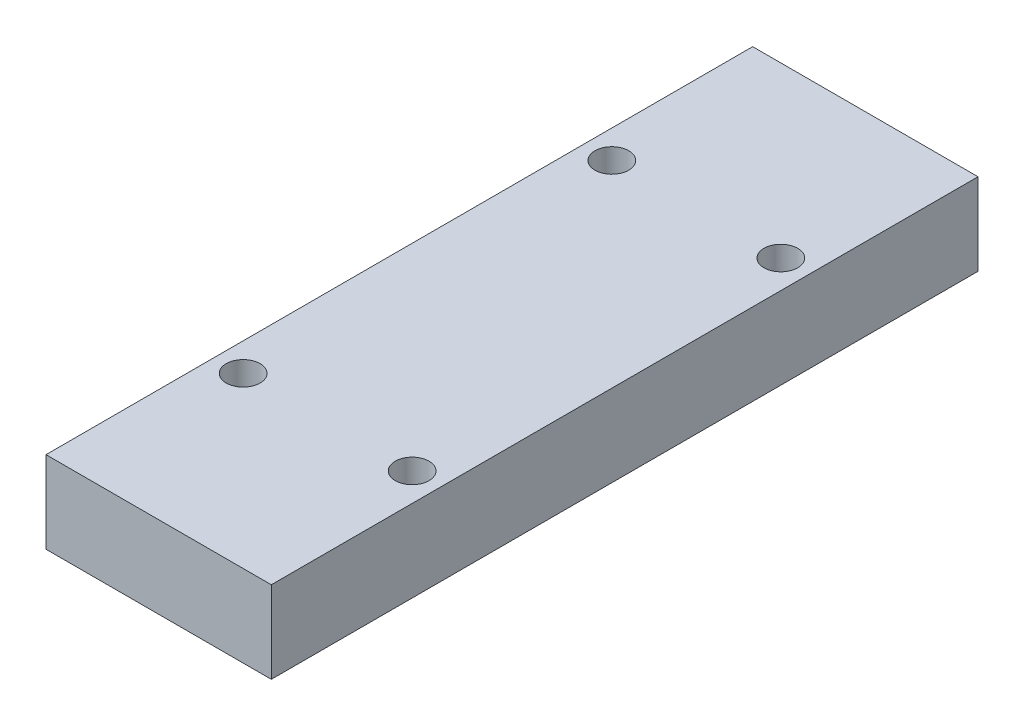
ISO-10303-21;
HEADER;
FILE_DESCRIPTION(('STEP AP214'),'2;1');
FILE_NAME('part.step','',(''),(''),'','','');
FILE_SCHEMA(('AUTOMOTIVE_DESIGN { 1 0 10303 214 1 1 1 1 }'));
ENDSEC;
DATA;
#1=APPLICATION_CONTEXT('core data for automotive mechanical design processes');
#2=APPLICATION_PROTOCOL_DEFINITION('international standard','automotive_design',2000,#1);
#3=PRODUCT_CONTEXT('',#1,'mechanical');
#4=PRODUCT('Part','Part','',(#3));
#5=PRODUCT_RELATED_PRODUCT_CATEGORY('part','',(#4));
#6=PRODUCT_DEFINITION_FORMATION('','',#4);
#7=PRODUCT_DEFINITION_CONTEXT('part definition',#1,'design');
#8=PRODUCT_DEFINITION('design','',#6,#7);
#9=PRODUCT_DEFINITION_SHAPE('','',#8);
#10=(LENGTH_UNIT() NAMED_UNIT(*) SI_UNIT(.MILLI.,.METRE.));
#11=(NAMED_UNIT(*) PLANE_ANGLE_UNIT() SI_UNIT($,.RADIAN.));
#12=(NAMED_UNIT(*) SI_UNIT($,.STERADIAN.) SOLID_ANGLE_UNIT());
#13=UNCERTAINTY_MEASURE_WITH_UNIT(LENGTH_MEASURE(1.E-05),#10,'distance_accuracy_value','');
#14=(GEOMETRIC_REPRESENTATION_CONTEXT(3) GLOBAL_UNCERTAINTY_ASSIGNED_CONTEXT((#13)) GLOBAL_UNIT_ASSIGNED_CONTEXT((#10,
#11,#12)) REPRESENTATION_CONTEXT('',''));
#15=CARTESIAN_POINT('',(0.,0.,0.));
#16=DIRECTION('',(0.,0.,1.));
#17=DIRECTION('',(1.,0.,0.));
#18=AXIS2_PLACEMENT_3D('',#15,#16,#17);
#19=CARTESIAN_POINT('',(11.,4.,69.));
#20=DIRECTION('',(-1.,0.,0.));
#21=DIRECTION('',(0.,-1.,0.));
#22=AXIS2_PLACEMENT_3D('',#19,#20,#21);
#23=PLANE('',#22);
#24=DIRECTION('',(0.,1.,0.));
#25=VECTOR('',#24,1.);
#26=CARTESIAN_POINT('',(11.,4.,0.));
#27=LINE('',#26,#25);
#28=CARTESIAN_POINT('',(11.,-4.,0.));
#29=VERTEX_POINT('',#28);
#30=CARTESIAN_POINT('',(11.,4.,0.));
#31=VERTEX_POINT('',#30);
#32=EDGE_CURVE('E143',#29,#31,#27,.T.);
#33=ORIENTED_EDGE('',*,*,#32,.T.);
#34=DIRECTION('',(0.,0.,-1.));
#35=VECTOR('',#34,1.);
#36=CARTESIAN_POINT('',(11.,4.,69.));
#37=LINE('',#36,#35);
#38=CARTESIAN_POINT('',(11.,4.,69.));
#39=VERTEX_POINT('',#38);
#40=EDGE_CURVE('E11',#39,#31,#37,.T.);
#41=ORIENTED_EDGE('',*,*,#40,.F.);
#42=DIRECTION('',(0.,1.,0.));
#43=VECTOR('',#42,1.);
#44=CARTESIAN_POINT('',(11.,4.,69.));
#45=LINE('',#44,#43);
#46=CARTESIAN_POINT('',(11.,-4.,69.));
#47=VERTEX_POINT('',#46);
#48=EDGE_CURVE('E144',#47,#39,#45,.T.);
#49=ORIENTED_EDGE('',*,*,#48,.F.);
#50=DIRECTION('',(0.,0.,-1.));
#51=VECTOR('',#50,1.);
#52=CARTESIAN_POINT('',(11.,-4.,69.));
#53=LINE('',#52,#51);
#54=EDGE_CURVE('E154',#47,#29,#53,.T.);
#55=ORIENTED_EDGE('',*,*,#54,.T.);
#56=EDGE_LOOP('',(#33,#41,#49,#55));
#57=FACE_BOUND('',#56,.T.);
#58=ADVANCED_FACE('F41',(#57),#23,.F.);
#59=CARTESIAN_POINT('',(-11.,4.,69.));
#60=DIRECTION('',(0.,-1.,0.));
#61=DIRECTION('',(0.,0.,-1.));
#62=AXIS2_PLACEMENT_3D('',#59,#60,#61);
#63=PLANE('',#62);
#64=CARTESIAN_POINT('',(-8.25,4.,16.5));
#65=DIRECTION('',(0.,1.,0.));
#66=DIRECTION('',(0.,0.,1.));
#67=AXIS2_PLACEMENT_3D('',#64,#65,#66);
#68=CIRCLE('',#67,1.64999999999999);
#69=CARTESIAN_POINT('',(-8.25,4.,18.15));
#70=VERTEX_POINT('',#69);
#71=EDGE_CURVE('E114',#70,#70,#68,.T.);
#72=ORIENTED_EDGE('',*,*,#71,.F.);
#73=EDGE_LOOP('',(#72));
#74=FACE_BOUND('',#73,.T.);
#75=CARTESIAN_POINT('',(8.25,4.,16.5));
#76=DIRECTION('',(0.,1.,0.));
#77=DIRECTION('',(0.,0.,1.));
#78=AXIS2_PLACEMENT_3D('',#75,#76,#77);
#79=CIRCLE('',#78,1.64999999999999);
#80=CARTESIAN_POINT('',(8.25,4.,18.15));
#81=VERTEX_POINT('',#80);
#82=EDGE_CURVE('E113',#81,#81,#79,.T.);
#83=ORIENTED_EDGE('',*,*,#82,.F.);
#84=EDGE_LOOP('',(#83));
#85=FACE_BOUND('',#84,.T.);
#86=CARTESIAN_POINT('',(8.25000000000001,4.,52.5));
#87=DIRECTION('',(0.,1.,0.));
#88=DIRECTION('',(0.,0.,1.));
#89=AXIS2_PLACEMENT_3D('',#86,#87,#88);
#90=CIRCLE('',#89,1.64999999999999);
#91=CARTESIAN_POINT('',(8.25000000000001,4.,54.15));
#92=VERTEX_POINT('',#91);
#93=EDGE_CURVE('E127',#92,#92,#90,.T.);
#94=ORIENTED_EDGE('',*,*,#93,.F.);
#95=EDGE_LOOP('',(#94));
#96=FACE_BOUND('',#95,.T.);
#97=CARTESIAN_POINT('',(-8.24999999999999,4.,52.5));
#98=DIRECTION('',(0.,1.,0.));
#99=DIRECTION('',(0.,0.,1.));
#100=AXIS2_PLACEMENT_3D('',#97,#98,#99);
#101=CIRCLE('',#100,1.64999999999999);
#102=CARTESIAN_POINT('',(-8.24999999999999,4.,54.15));
#103=VERTEX_POINT('',#102);
#104=EDGE_CURVE('E135',#103,#103,#101,.T.);
#105=ORIENTED_EDGE('',*,*,#104,.F.);
#106=EDGE_LOOP('',(#105));
#107=FACE_BOUND('',#106,.T.);
#108=DIRECTION('',(-1.,0.,0.));
#109=VECTOR('',#108,1.);
#110=CARTESIAN_POINT('',(-11.,4.,0.));
#111=LINE('',#110,#109);
#112=CARTESIAN_POINT('',(-11.,4.,0.));
#113=VERTEX_POINT('',#112);
#114=EDGE_CURVE('E158',#31,#113,#111,.T.);
#115=ORIENTED_EDGE('',*,*,#114,.T.);
#116=DIRECTION('',(0.,0.,-1.));
#117=VECTOR('',#116,1.);
#118=CARTESIAN_POINT('',(-11.,4.,69.));
#119=LINE('',#118,#117);
#120=CARTESIAN_POINT('',(-11.,4.,69.));
#121=VERTEX_POINT('',#120);
#122=EDGE_CURVE('E50',#121,#113,#119,.T.);
#123=ORIENTED_EDGE('',*,*,#122,.F.);
#124=DIRECTION('',(-1.,0.,0.));
#125=VECTOR('',#124,1.);
#126=CARTESIAN_POINT('',(-11.,4.,69.));
#127=LINE('',#126,#125);
#128=EDGE_CURVE('E89',#39,#121,#127,.T.);
#129=ORIENTED_EDGE('',*,*,#128,.F.);
#130=ORIENTED_EDGE('',*,*,#40,.T.);
#131=EDGE_LOOP('',(#115,#123,#129,#130));
#132=FACE_BOUND('',#131,.T.);
#133=ADVANCED_FACE('F187',(#74,#85,#96,#107,#132),#63,.F.);
#134=CARTESIAN_POINT('',(-11.,4.,69.));
#135=DIRECTION('',(1.,0.,0.));
#136=DIRECTION('',(0.,0.,-1.));
#137=AXIS2_PLACEMENT_3D('',#134,#135,#136);
#138=PLANE('',#137);
#139=DIRECTION('',(0.,-1.,0.));
#140=VECTOR('',#139,1.);
#141=CARTESIAN_POINT('',(-11.,4.,0.));
#142=LINE('',#141,#140);
#143=CARTESIAN_POINT('',(-11.,-4.,0.));
#144=VERTEX_POINT('',#143);
#145=EDGE_CURVE('E76',#113,#144,#142,.T.);
#146=ORIENTED_EDGE('',*,*,#145,.T.);
#147=DIRECTION('',(0.,0.,-1.));
#148=VECTOR('',#147,1.);
#149=CARTESIAN_POINT('',(-11.,-4.,69.));
#150=LINE('',#149,#148);
#151=CARTESIAN_POINT('',(-11.,-4.,69.));
#152=VERTEX_POINT('',#151);
#153=EDGE_CURVE('E167',#152,#144,#150,.T.);
#154=ORIENTED_EDGE('',*,*,#153,.F.);
#155=DIRECTION('',(0.,-1.,0.));
#156=VECTOR('',#155,1.);
#157=CARTESIAN_POINT('',(-11.,4.,69.));
#158=LINE('',#157,#156);
#159=EDGE_CURVE('E149',#121,#152,#158,.T.);
#160=ORIENTED_EDGE('',*,*,#159,.F.);
#161=ORIENTED_EDGE('',*,*,#122,.T.);
#162=EDGE_LOOP('',(#146,#154,#160,#161));
#163=FACE_BOUND('',#162,.T.);
#164=ADVANCED_FACE('F171',(#163),#138,.F.);
#165=CARTESIAN_POINT('',(-11.,-4.,69.));
#166=DIRECTION('',(0.,1.,0.));
#167=DIRECTION('',(0.,0.,1.));
#168=AXIS2_PLACEMENT_3D('',#165,#166,#167);
#169=PLANE('',#168);
#170=DIRECTION('',(1.,0.,0.));
#171=VECTOR('',#170,1.);
#172=CARTESIAN_POINT('',(-11.,-4.,0.));
#173=LINE('',#172,#171);
#174=EDGE_CURVE('E82',#144,#29,#173,.T.);
#175=ORIENTED_EDGE('',*,*,#174,.T.);
#176=ORIENTED_EDGE('',*,*,#54,.F.);
#177=DIRECTION('',(1.,0.,0.));
#178=VECTOR('',#177,1.);
#179=CARTESIAN_POINT('',(-11.,-4.,69.));
#180=LINE('',#179,#178);
#181=EDGE_CURVE('E58',#152,#47,#180,.T.);
#182=ORIENTED_EDGE('',*,*,#181,.F.);
#183=ORIENTED_EDGE('',*,*,#153,.T.);
#184=EDGE_LOOP('',(#175,#176,#182,#183));
#185=FACE_BOUND('',#184,.T.);
#186=ADVANCED_FACE('F178',(#185),#169,.F.);
#187=CARTESIAN_POINT('',(0.,0.,69.));
#188=DIRECTION('',(0.,0.,1.));
#189=DIRECTION('',(1.,0.,0.));
#190=AXIS2_PLACEMENT_3D('',#187,#188,#189);
#191=PLANE('',#190);
#192=ORIENTED_EDGE('',*,*,#48,.T.);
#193=ORIENTED_EDGE('',*,*,#128,.T.);
#194=ORIENTED_EDGE('',*,*,#159,.T.);
#195=ORIENTED_EDGE('',*,*,#181,.T.);
#196=EDGE_LOOP('',(#192,#193,#194,#195));
#197=FACE_BOUND('',#196,.T.);
#198=ADVANCED_FACE('F180',(#197),#191,.T.);
#199=CARTESIAN_POINT('',(0.,0.,0.));
#200=DIRECTION('',(0.,0.,1.));
#201=DIRECTION('',(1.,0.,0.));
#202=AXIS2_PLACEMENT_3D('',#199,#200,#201);
#203=PLANE('',#202);
#204=ORIENTED_EDGE('',*,*,#32,.F.);
#205=ORIENTED_EDGE('',*,*,#174,.F.);
#206=ORIENTED_EDGE('',*,*,#145,.F.);
#207=ORIENTED_EDGE('',*,*,#114,.F.);
#208=EDGE_LOOP('',(#204,#205,#206,#207));
#209=FACE_BOUND('',#208,.T.);
#210=ADVANCED_FACE('F174',(#209),#203,.F.);
#211=CARTESIAN_POINT('',(-8.24999999999999,-3.,52.5));
#212=DIRECTION('',(0.,1.,0.));
#213=DIRECTION('',(0.,0.,1.));
#214=AXIS2_PLACEMENT_3D('',#211,#212,#213);
#215=CONICAL_SURFACE('',#214,1.65,1.02974425867665);
#216=CARTESIAN_POINT('',(-8.25,-3.99142002139547,52.5));
#217=VERTEX_POINT('',#216);
#218=VERTEX_LOOP('',#217);
#219=FACE_BOUND('',#218,.T.);
#220=CARTESIAN_POINT('',(-8.24999999999999,-3.,52.5));
#221=DIRECTION('',(0.,1.,0.));
#222=DIRECTION('',(0.,0.,1.));
#223=AXIS2_PLACEMENT_3D('',#220,#221,#222);
#224=CIRCLE('',#223,1.65);
#225=CARTESIAN_POINT('',(-8.24999999999999,-3.,54.15));
#226=VERTEX_POINT('',#225);
#227=EDGE_CURVE('E139',#226,#226,#224,.T.);
#228=ORIENTED_EDGE('',*,*,#227,.T.);
#229=EDGE_LOOP('',(#228));
#230=FACE_BOUND('',#229,.T.);
#231=ADVANCED_FACE('F208',(#219,#230),#215,.F.);
#232=CARTESIAN_POINT('',(-8.24999999999999,4.,52.5));
#233=DIRECTION('',(0.,1.,0.));
#234=DIRECTION('',(0.,0.,1.));
#235=AXIS2_PLACEMENT_3D('',#232,#233,#234);
#236=CYLINDRICAL_SURFACE('',#235,1.64999999999999);
#237=ORIENTED_EDGE('',*,*,#227,.F.);
#238=EDGE_LOOP('',(#237));
#239=FACE_BOUND('',#238,.T.);
#240=ORIENTED_EDGE('',*,*,#104,.T.);
#241=EDGE_LOOP('',(#240));
#242=FACE_BOUND('',#241,.T.);
#243=ADVANCED_FACE('F205',(#239,#242),#236,.F.);
#244=CARTESIAN_POINT('',(8.25000000000001,-3.,52.5));
#245=DIRECTION('',(0.,1.,0.));
#246=DIRECTION('',(0.,0.,1.));
#247=AXIS2_PLACEMENT_3D('',#244,#245,#246);
#248=CONICAL_SURFACE('',#247,1.65,1.02974425867665);
#249=CARTESIAN_POINT('',(8.25000000000001,-3.99142002139547,52.5));
#250=VERTEX_POINT('',#249);
#251=VERTEX_LOOP('',#250);
#252=FACE_BOUND('',#251,.T.);
#253=CARTESIAN_POINT('',(8.25000000000001,-3.,52.5));
#254=DIRECTION('',(0.,1.,0.));
#255=DIRECTION('',(0.,0.,1.));
#256=AXIS2_PLACEMENT_3D('',#253,#254,#255);
#257=CIRCLE('',#256,1.65);
#258=CARTESIAN_POINT('',(8.25000000000001,-3.,54.15));
#259=VERTEX_POINT('',#258);
#260=EDGE_CURVE('E131',#259,#259,#257,.T.);
#261=ORIENTED_EDGE('',*,*,#260,.T.);
#262=EDGE_LOOP('',(#261));
#263=FACE_BOUND('',#262,.T.);
#264=ADVANCED_FACE('F207',(#252,#263),#248,.F.);
#265=CARTESIAN_POINT('',(8.25000000000001,4.,52.5));
#266=DIRECTION('',(0.,1.,0.));
#267=DIRECTION('',(0.,0.,1.));
#268=AXIS2_PLACEMENT_3D('',#265,#266,#267);
#269=CYLINDRICAL_SURFACE('',#268,1.64999999999999);
#270=ORIENTED_EDGE('',*,*,#260,.F.);
#271=EDGE_LOOP('',(#270));
#272=FACE_BOUND('',#271,.T.);
#273=ORIENTED_EDGE('',*,*,#93,.T.);
#274=EDGE_LOOP('',(#273));
#275=FACE_BOUND('',#274,.T.);
#276=ADVANCED_FACE('F215',(#272,#275),#269,.F.);
#277=CARTESIAN_POINT('',(8.25,-3.,16.5));
#278=DIRECTION('',(0.,1.,0.));
#279=DIRECTION('',(0.,0.,1.));
#280=AXIS2_PLACEMENT_3D('',#277,#278,#279);
#281=CONICAL_SURFACE('',#280,1.65,1.02974425867665);
#282=CARTESIAN_POINT('',(8.25,-3.99142002139547,16.5));
#283=VERTEX_POINT('',#282);
#284=VERTEX_LOOP('',#283);
#285=FACE_BOUND('',#284,.T.);
#286=CARTESIAN_POINT('',(8.25,-3.,16.5));
#287=DIRECTION('',(0.,1.,0.));
#288=DIRECTION('',(0.,0.,1.));
#289=AXIS2_PLACEMENT_3D('',#286,#287,#288);
#290=CIRCLE('',#289,1.65);
#291=CARTESIAN_POINT('',(8.25,-3.,18.15));
#292=VERTEX_POINT('',#291);
#293=EDGE_CURVE('E119',#292,#292,#290,.T.);
#294=ORIENTED_EDGE('',*,*,#293,.T.);
#295=EDGE_LOOP('',(#294));
#296=FACE_BOUND('',#295,.T.);
#297=ADVANCED_FACE('F255',(#285,#296),#281,.F.);
#298=CARTESIAN_POINT('',(8.25,4.,16.5));
#299=DIRECTION('',(0.,1.,0.));
#300=DIRECTION('',(0.,0.,1.));
#301=AXIS2_PLACEMENT_3D('',#298,#299,#300);
#302=CYLINDRICAL_SURFACE('',#301,1.64999999999999);
#303=ORIENTED_EDGE('',*,*,#293,.F.);
#304=EDGE_LOOP('',(#303));
#305=FACE_BOUND('',#304,.T.);
#306=ORIENTED_EDGE('',*,*,#82,.T.);
#307=EDGE_LOOP('',(#306));
#308=FACE_BOUND('',#307,.T.);
#309=ADVANCED_FACE('F106',(#305,#308),#302,.F.);
#310=CARTESIAN_POINT('',(-8.25,-3.,16.5));
#311=DIRECTION('',(0.,1.,0.));
#312=DIRECTION('',(0.,0.,1.));
#313=AXIS2_PLACEMENT_3D('',#310,#311,#312);
#314=CONICAL_SURFACE('',#313,1.65,1.02974425867665);
#315=CARTESIAN_POINT('',(-8.25,-3.99142002139547,16.5));
#316=VERTEX_POINT('',#315);
#317=VERTEX_LOOP('',#316);
#318=FACE_BOUND('',#317,.T.);
#319=CARTESIAN_POINT('',(-8.25,-3.,16.5));
#320=DIRECTION('',(0.,1.,0.));
#321=DIRECTION('',(0.,0.,1.));
#322=AXIS2_PLACEMENT_3D('',#319,#320,#321);
#323=CIRCLE('',#322,1.65);
#324=CARTESIAN_POINT('',(-8.25,-3.,18.15));
#325=VERTEX_POINT('',#324);
#326=EDGE_CURVE('E110',#325,#325,#323,.T.);
#327=ORIENTED_EDGE('',*,*,#326,.T.);
#328=EDGE_LOOP('',(#327));
#329=FACE_BOUND('',#328,.T.);
#330=ADVANCED_FACE('F102',(#318,#329),#314,.F.);
#331=CARTESIAN_POINT('',(-8.25,4.,16.5));
#332=DIRECTION('',(0.,1.,0.));
#333=DIRECTION('',(0.,0.,1.));
#334=AXIS2_PLACEMENT_3D('',#331,#332,#333);
#335=CYLINDRICAL_SURFACE('',#334,1.64999999999999);
#336=ORIENTED_EDGE('',*,*,#326,.F.);
#337=EDGE_LOOP('',(#336));
#338=FACE_BOUND('',#337,.T.);
#339=ORIENTED_EDGE('',*,*,#71,.T.);
#340=EDGE_LOOP('',(#339));
#341=FACE_BOUND('',#340,.T.);
#342=ADVANCED_FACE('F105',(#338,#341),#335,.F.);
#343=CLOSED_SHELL('',(#58,#133,#164,#186,#198,#210,#231,#243,#264,#276,#297,#309,#330,#342));
#344=MANIFOLD_SOLID_BREP('B2',#343);
#345=ADVANCED_BREP_SHAPE_REPRESENTATION('',(#18,#344),#14);
#346=SHAPE_DEFINITION_REPRESENTATION(#9,#345);
ENDSEC;
END-ISO-10303-21;
